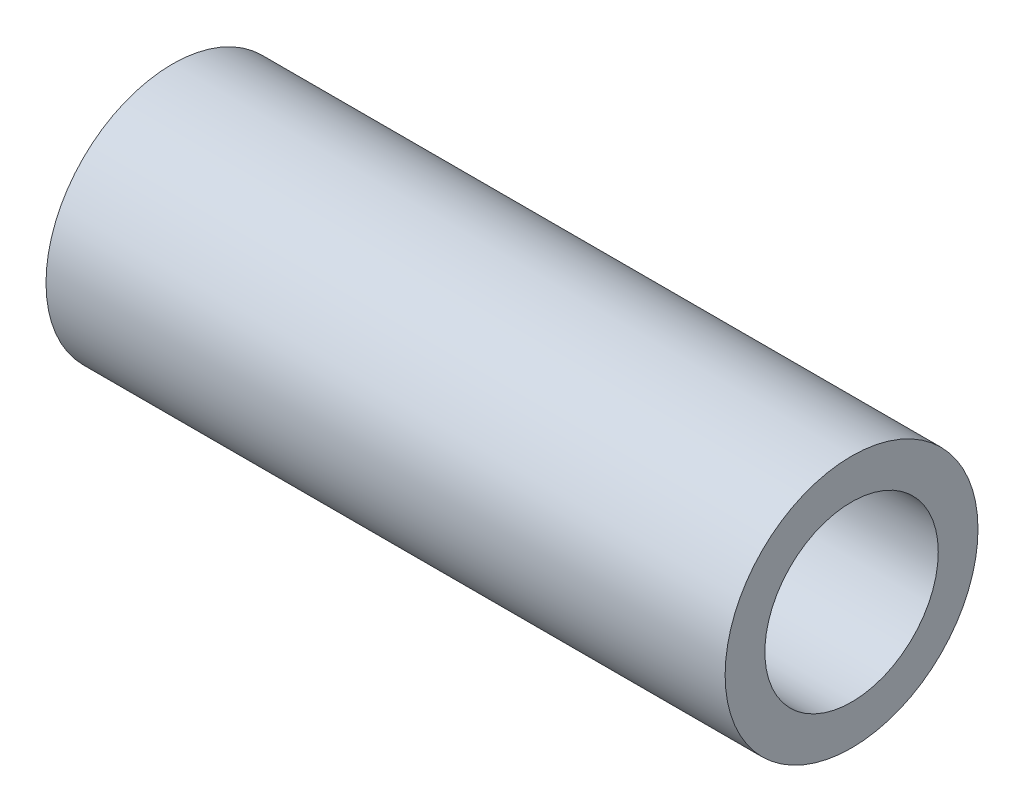
ISO-10303-21;
HEADER;
FILE_DESCRIPTION(('STEP AP214'),'2;1');
FILE_NAME('part.step','',(''),(''),'','','');
FILE_SCHEMA(('AUTOMOTIVE_DESIGN { 1 0 10303 214 1 1 1 1 }'));
ENDSEC;
DATA;
#1=APPLICATION_CONTEXT('core data for automotive mechanical design processes');
#2=APPLICATION_PROTOCOL_DEFINITION('international standard','automotive_design',2000,#1);
#3=PRODUCT_CONTEXT('',#1,'mechanical');
#4=PRODUCT('Part','Part','',(#3));
#5=PRODUCT_RELATED_PRODUCT_CATEGORY('part','',(#4));
#6=PRODUCT_DEFINITION_FORMATION('','',#4);
#7=PRODUCT_DEFINITION_CONTEXT('part definition',#1,'design');
#8=PRODUCT_DEFINITION('design','',#6,#7);
#9=PRODUCT_DEFINITION_SHAPE('','',#8);
#10=(LENGTH_UNIT() NAMED_UNIT(*) SI_UNIT(.MILLI.,.METRE.));
#11=(NAMED_UNIT(*) PLANE_ANGLE_UNIT() SI_UNIT($,.RADIAN.));
#12=(NAMED_UNIT(*) SI_UNIT($,.STERADIAN.) SOLID_ANGLE_UNIT());
#13=UNCERTAINTY_MEASURE_WITH_UNIT(LENGTH_MEASURE(1.E-05),#10,'distance_accuracy_value','');
#14=(GEOMETRIC_REPRESENTATION_CONTEXT(3) GLOBAL_UNCERTAINTY_ASSIGNED_CONTEXT((#13)) GLOBAL_UNIT_ASSIGNED_CONTEXT((#10,
#11,#12)) REPRESENTATION_CONTEXT('',''));
#15=CARTESIAN_POINT('',(0.,0.,0.));
#16=DIRECTION('',(0.,0.,1.));
#17=DIRECTION('',(1.,0.,0.));
#18=AXIS2_PLACEMENT_3D('',#15,#16,#17);
#19=CARTESIAN_POINT('',(23.876,0.,0.));
#20=DIRECTION('',(-1.,0.,0.));
#21=DIRECTION('',(0.,0.,1.));
#22=AXIS2_PLACEMENT_3D('',#19,#20,#21);
#23=CYLINDRICAL_SURFACE('',#22,3.048);
#24=CARTESIAN_POINT('',(23.876,0.,0.));
#25=DIRECTION('',(1.,0.,0.));
#26=DIRECTION('',(0.,0.,-1.));
#27=AXIS2_PLACEMENT_3D('',#24,#25,#26);
#28=CIRCLE('',#27,3.048);
#29=CARTESIAN_POINT('',(23.876,0.,-3.048));
#30=VERTEX_POINT('',#29);
#31=EDGE_CURVE('E40',#30,#30,#28,.T.);
#32=ORIENTED_EDGE('',*,*,#31,.T.);
#33=EDGE_LOOP('',(#32));
#34=FACE_BOUND('',#33,.T.);
#35=CARTESIAN_POINT('',(0.,0.,0.));
#36=DIRECTION('',(1.,0.,0.));
#37=DIRECTION('',(0.,0.,-1.));
#38=AXIS2_PLACEMENT_3D('',#35,#36,#37);
#39=CIRCLE('',#38,3.048);
#40=CARTESIAN_POINT('',(0.,0.,-3.048));
#41=VERTEX_POINT('',#40);
#42=EDGE_CURVE('E46',#41,#41,#39,.T.);
#43=ORIENTED_EDGE('',*,*,#42,.F.);
#44=EDGE_LOOP('',(#43));
#45=FACE_BOUND('',#44,.T.);
#46=ADVANCED_FACE('F33',(#34,#45),#23,.F.);
#47=CARTESIAN_POINT('',(23.876,0.,0.));
#48=DIRECTION('',(-1.,0.,0.));
#49=DIRECTION('',(0.,0.,1.));
#50=AXIS2_PLACEMENT_3D('',#47,#48,#49);
#51=CYLINDRICAL_SURFACE('',#50,4.445);
#52=CARTESIAN_POINT('',(23.876,0.,0.));
#53=DIRECTION('',(1.,0.,0.));
#54=DIRECTION('',(0.,0.,-1.));
#55=AXIS2_PLACEMENT_3D('',#52,#53,#54);
#56=CIRCLE('',#55,4.445);
#57=CARTESIAN_POINT('',(23.876,0.,-4.445));
#58=VERTEX_POINT('',#57);
#59=EDGE_CURVE('E10',#58,#58,#56,.T.);
#60=ORIENTED_EDGE('',*,*,#59,.F.);
#61=EDGE_LOOP('',(#60));
#62=FACE_BOUND('',#61,.T.);
#63=CARTESIAN_POINT('',(0.,0.,0.));
#64=DIRECTION('',(1.,0.,0.));
#65=DIRECTION('',(0.,0.,-1.));
#66=AXIS2_PLACEMENT_3D('',#63,#64,#65);
#67=CIRCLE('',#66,4.445);
#68=CARTESIAN_POINT('',(0.,0.,-4.445));
#69=VERTEX_POINT('',#68);
#70=EDGE_CURVE('E36',#69,#69,#67,.T.);
#71=ORIENTED_EDGE('',*,*,#70,.T.);
#72=EDGE_LOOP('',(#71));
#73=FACE_BOUND('',#72,.T.);
#74=ADVANCED_FACE('F53',(#62,#73),#51,.T.);
#75=CARTESIAN_POINT('',(23.876,0.,0.));
#76=DIRECTION('',(1.,0.,0.));
#77=DIRECTION('',(0.,0.,-1.));
#78=AXIS2_PLACEMENT_3D('',#75,#76,#77);
#79=PLANE('',#78);
#80=ORIENTED_EDGE('',*,*,#31,.F.);
#81=EDGE_LOOP('',(#80));
#82=FACE_BOUND('',#81,.T.);
#83=ORIENTED_EDGE('',*,*,#59,.T.);
#84=EDGE_LOOP('',(#83));
#85=FACE_BOUND('',#84,.T.);
#86=ADVANCED_FACE('F57',(#82,#85),#79,.T.);
#87=CARTESIAN_POINT('',(0.,0.,0.));
#88=DIRECTION('',(1.,0.,0.));
#89=DIRECTION('',(0.,0.,-1.));
#90=AXIS2_PLACEMENT_3D('',#87,#88,#89);
#91=PLANE('',#90);
#92=ORIENTED_EDGE('',*,*,#42,.T.);
#93=EDGE_LOOP('',(#92));
#94=FACE_BOUND('',#93,.T.);
#95=ORIENTED_EDGE('',*,*,#70,.F.);
#96=EDGE_LOOP('',(#95));
#97=FACE_BOUND('',#96,.T.);
#98=ADVANCED_FACE('F55',(#94,#97),#91,.F.);
#99=CLOSED_SHELL('',(#46,#74,#86,#98));
#100=MANIFOLD_SOLID_BREP('B2',#99);
#101=ADVANCED_BREP_SHAPE_REPRESENTATION('',(#18,#100),#14);
#102=SHAPE_DEFINITION_REPRESENTATION(#9,#101);
ENDSEC;
END-ISO-10303-21;
